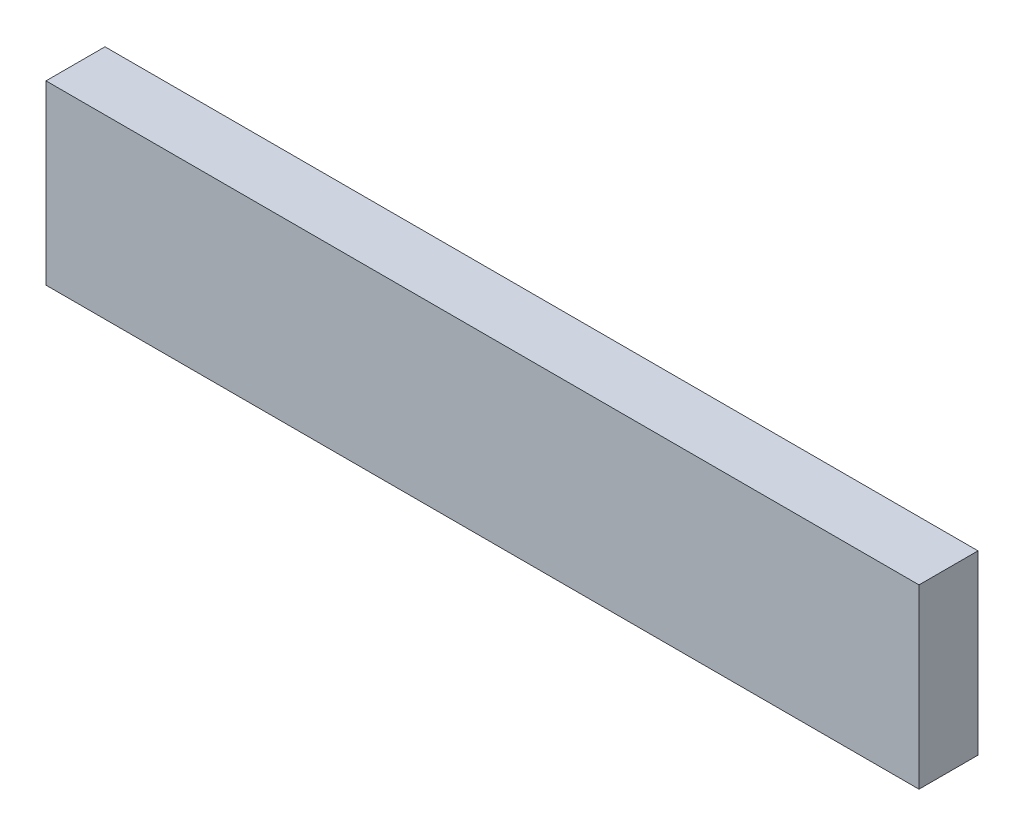
ISO-10303-21;
HEADER;
FILE_DESCRIPTION(('STEP AP214'),'2;1');
FILE_NAME('part.step','',(''),(''),'','','');
FILE_SCHEMA(('AUTOMOTIVE_DESIGN { 1 0 10303 214 1 1 1 1 }'));
ENDSEC;
DATA;
#1=APPLICATION_CONTEXT('core data for automotive mechanical design processes');
#2=APPLICATION_PROTOCOL_DEFINITION('international standard','automotive_design',2000,#1);
#3=PRODUCT_CONTEXT('',#1,'mechanical');
#4=PRODUCT('Part','Part','',(#3));
#5=PRODUCT_RELATED_PRODUCT_CATEGORY('part','',(#4));
#6=PRODUCT_DEFINITION_FORMATION('','',#4);
#7=PRODUCT_DEFINITION_CONTEXT('part definition',#1,'design');
#8=PRODUCT_DEFINITION('design','',#6,#7);
#9=PRODUCT_DEFINITION_SHAPE('','',#8);
#10=(LENGTH_UNIT() NAMED_UNIT(*) SI_UNIT(.MILLI.,.METRE.));
#11=(NAMED_UNIT(*) PLANE_ANGLE_UNIT() SI_UNIT($,.RADIAN.));
#12=(NAMED_UNIT(*) SI_UNIT($,.STERADIAN.) SOLID_ANGLE_UNIT());
#13=UNCERTAINTY_MEASURE_WITH_UNIT(LENGTH_MEASURE(1.E-05),#10,'distance_accuracy_value','');
#14=(GEOMETRIC_REPRESENTATION_CONTEXT(3) GLOBAL_UNCERTAINTY_ASSIGNED_CONTEXT((#13)) GLOBAL_UNIT_ASSIGNED_CONTEXT((#10,
#11,#12)) REPRESENTATION_CONTEXT('',''));
#15=CARTESIAN_POINT('',(0.,0.,0.));
#16=DIRECTION('',(0.,0.,1.));
#17=DIRECTION('',(1.,0.,0.));
#18=AXIS2_PLACEMENT_3D('',#15,#16,#17);
#19=CARTESIAN_POINT('',(37.,7.5,5.));
#20=DIRECTION('',(-1.,0.,0.));
#21=DIRECTION('',(0.,0.,1.));
#22=AXIS2_PLACEMENT_3D('',#19,#20,#21);
#23=PLANE('',#22);
#24=DIRECTION('',(0.,1.,0.));
#25=VECTOR('',#24,1.);
#26=CARTESIAN_POINT('',(37.,7.5,0.));
#27=LINE('',#26,#25);
#28=CARTESIAN_POINT('',(37.,-7.5,0.));
#29=VERTEX_POINT('',#28);
#30=CARTESIAN_POINT('',(37.,7.5,0.));
#31=VERTEX_POINT('',#30);
#32=EDGE_CURVE('E96',#29,#31,#27,.T.);
#33=ORIENTED_EDGE('',*,*,#32,.T.);
#34=DIRECTION('',(0.,0.,-1.));
#35=VECTOR('',#34,1.);
#36=CARTESIAN_POINT('',(37.,7.5,5.));
#37=LINE('',#36,#35);
#38=CARTESIAN_POINT('',(37.,7.5,5.));
#39=VERTEX_POINT('',#38);
#40=EDGE_CURVE('E11',#39,#31,#37,.T.);
#41=ORIENTED_EDGE('',*,*,#40,.F.);
#42=DIRECTION('',(0.,1.,0.));
#43=VECTOR('',#42,1.);
#44=CARTESIAN_POINT('',(37.,7.5,5.));
#45=LINE('',#44,#43);
#46=CARTESIAN_POINT('',(37.,-7.5,5.));
#47=VERTEX_POINT('',#46);
#48=EDGE_CURVE('E84',#47,#39,#45,.T.);
#49=ORIENTED_EDGE('',*,*,#48,.F.);
#50=DIRECTION('',(0.,0.,-1.));
#51=VECTOR('',#50,1.);
#52=CARTESIAN_POINT('',(37.,-7.5,5.));
#53=LINE('',#52,#51);
#54=EDGE_CURVE('E92',#47,#29,#53,.T.);
#55=ORIENTED_EDGE('',*,*,#54,.T.);
#56=EDGE_LOOP('',(#33,#41,#49,#55));
#57=FACE_BOUND('',#56,.T.);
#58=ADVANCED_FACE('F33',(#57),#23,.F.);
#59=CARTESIAN_POINT('',(-37.,7.5,5.));
#60=DIRECTION('',(0.,-1.,0.));
#61=DIRECTION('',(1.,0.,0.));
#62=AXIS2_PLACEMENT_3D('',#59,#60,#61);
#63=PLANE('',#62);
#64=DIRECTION('',(-1.,0.,0.));
#65=VECTOR('',#64,1.);
#66=CARTESIAN_POINT('',(-37.,7.5,0.));
#67=LINE('',#66,#65);
#68=CARTESIAN_POINT('',(-37.,7.5,0.));
#69=VERTEX_POINT('',#68);
#70=EDGE_CURVE('E88',#31,#69,#67,.T.);
#71=ORIENTED_EDGE('',*,*,#70,.T.);
#72=DIRECTION('',(0.,0.,-1.));
#73=VECTOR('',#72,1.);
#74=CARTESIAN_POINT('',(-37.,7.5,5.));
#75=LINE('',#74,#73);
#76=CARTESIAN_POINT('',(-37.,7.5,5.));
#77=VERTEX_POINT('',#76);
#78=EDGE_CURVE('E41',#77,#69,#75,.T.);
#79=ORIENTED_EDGE('',*,*,#78,.F.);
#80=DIRECTION('',(-1.,0.,0.));
#81=VECTOR('',#80,1.);
#82=CARTESIAN_POINT('',(-37.,7.5,5.));
#83=LINE('',#82,#81);
#84=EDGE_CURVE('E79',#39,#77,#83,.T.);
#85=ORIENTED_EDGE('',*,*,#84,.F.);
#86=ORIENTED_EDGE('',*,*,#40,.T.);
#87=EDGE_LOOP('',(#71,#79,#85,#86));
#88=FACE_BOUND('',#87,.T.);
#89=ADVANCED_FACE('F87',(#88),#63,.F.);
#90=CARTESIAN_POINT('',(-37.,7.5,5.));
#91=DIRECTION('',(1.,0.,0.));
#92=DIRECTION('',(0.,0.,-1.));
#93=AXIS2_PLACEMENT_3D('',#90,#91,#92);
#94=PLANE('',#93);
#95=DIRECTION('',(0.,-1.,0.));
#96=VECTOR('',#95,1.);
#97=CARTESIAN_POINT('',(-37.,7.5,0.));
#98=LINE('',#97,#96);
#99=CARTESIAN_POINT('',(-37.,-7.5,0.));
#100=VERTEX_POINT('',#99);
#101=EDGE_CURVE('E66',#69,#100,#98,.T.);
#102=ORIENTED_EDGE('',*,*,#101,.T.);
#103=DIRECTION('',(0.,0.,-1.));
#104=VECTOR('',#103,1.);
#105=CARTESIAN_POINT('',(-37.,-7.5,5.));
#106=LINE('',#105,#104);
#107=CARTESIAN_POINT('',(-37.,-7.5,5.));
#108=VERTEX_POINT('',#107);
#109=EDGE_CURVE('E89',#108,#100,#106,.T.);
#110=ORIENTED_EDGE('',*,*,#109,.F.);
#111=DIRECTION('',(0.,-1.,0.));
#112=VECTOR('',#111,1.);
#113=CARTESIAN_POINT('',(-37.,7.5,5.));
#114=LINE('',#113,#112);
#115=EDGE_CURVE('E82',#77,#108,#114,.T.);
#116=ORIENTED_EDGE('',*,*,#115,.F.);
#117=ORIENTED_EDGE('',*,*,#78,.T.);
#118=EDGE_LOOP('',(#102,#110,#116,#117));
#119=FACE_BOUND('',#118,.T.);
#120=ADVANCED_FACE('F90',(#119),#94,.F.);
#121=CARTESIAN_POINT('',(-37.,-7.5,5.));
#122=DIRECTION('',(0.,1.,0.));
#123=DIRECTION('',(0.,0.,1.));
#124=AXIS2_PLACEMENT_3D('',#121,#122,#123);
#125=PLANE('',#124);
#126=DIRECTION('',(1.,0.,0.));
#127=VECTOR('',#126,1.);
#128=CARTESIAN_POINT('',(-37.,-7.5,0.));
#129=LINE('',#128,#127);
#130=EDGE_CURVE('E72',#100,#29,#129,.T.);
#131=ORIENTED_EDGE('',*,*,#130,.T.);
#132=ORIENTED_EDGE('',*,*,#54,.F.);
#133=DIRECTION('',(1.,0.,0.));
#134=VECTOR('',#133,1.);
#135=CARTESIAN_POINT('',(-37.,-7.5,5.));
#136=LINE('',#135,#134);
#137=EDGE_CURVE('E49',#108,#47,#136,.T.);
#138=ORIENTED_EDGE('',*,*,#137,.F.);
#139=ORIENTED_EDGE('',*,*,#109,.T.);
#140=EDGE_LOOP('',(#131,#132,#138,#139));
#141=FACE_BOUND('',#140,.T.);
#142=ADVANCED_FACE('F103',(#141),#125,.F.);
#143=CARTESIAN_POINT('',(0.,0.,5.));
#144=DIRECTION('',(0.,0.,1.));
#145=DIRECTION('',(1.,0.,0.));
#146=AXIS2_PLACEMENT_3D('',#143,#144,#145);
#147=PLANE('',#146);
#148=ORIENTED_EDGE('',*,*,#48,.T.);
#149=ORIENTED_EDGE('',*,*,#84,.T.);
#150=ORIENTED_EDGE('',*,*,#115,.T.);
#151=ORIENTED_EDGE('',*,*,#137,.T.);
#152=EDGE_LOOP('',(#148,#149,#150,#151));
#153=FACE_BOUND('',#152,.T.);
#154=ADVANCED_FACE('F80',(#153),#147,.T.);
#155=CARTESIAN_POINT('',(0.,0.,0.));
#156=DIRECTION('',(0.,0.,1.));
#157=DIRECTION('',(1.,0.,0.));
#158=AXIS2_PLACEMENT_3D('',#155,#156,#157);
#159=PLANE('',#158);
#160=ORIENTED_EDGE('',*,*,#32,.F.);
#161=ORIENTED_EDGE('',*,*,#130,.F.);
#162=ORIENTED_EDGE('',*,*,#101,.F.);
#163=ORIENTED_EDGE('',*,*,#70,.F.);
#164=EDGE_LOOP('',(#160,#161,#162,#163));
#165=FACE_BOUND('',#164,.T.);
#166=ADVANCED_FACE('F106',(#165),#159,.F.);
#167=CLOSED_SHELL('',(#58,#89,#120,#142,#154,#166));
#168=MANIFOLD_SOLID_BREP('B2',#167);
#169=ADVANCED_BREP_SHAPE_REPRESENTATION('',(#18,#168),#14);
#170=SHAPE_DEFINITION_REPRESENTATION(#9,#169);
ENDSEC;
END-ISO-10303-21;
